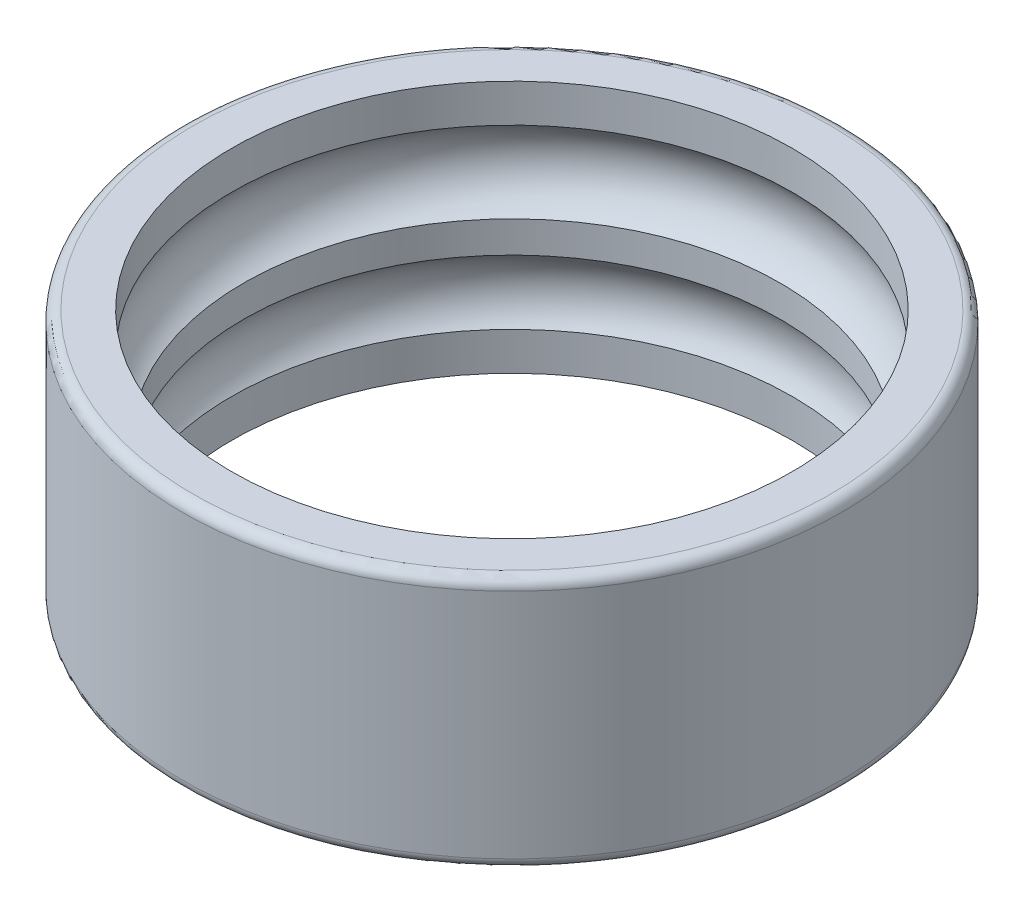
ISO-10303-21;
HEADER;
FILE_DESCRIPTION(('STEP AP214'),'2;1');
FILE_NAME('part.step','',(''),(''),'','','');
FILE_SCHEMA(('AUTOMOTIVE_DESIGN { 1 0 10303 214 1 1 1 1 }'));
ENDSEC;
DATA;
#1=APPLICATION_CONTEXT('core data for automotive mechanical design processes');
#2=APPLICATION_PROTOCOL_DEFINITION('international standard','automotive_design',2000,#1);
#3=PRODUCT_CONTEXT('',#1,'mechanical');
#4=PRODUCT('Part','Part','',(#3));
#5=PRODUCT_RELATED_PRODUCT_CATEGORY('part','',(#4));
#6=PRODUCT_DEFINITION_FORMATION('','',#4);
#7=PRODUCT_DEFINITION_CONTEXT('part definition',#1,'design');
#8=PRODUCT_DEFINITION('design','',#6,#7);
#9=PRODUCT_DEFINITION_SHAPE('','',#8);
#10=(LENGTH_UNIT() NAMED_UNIT(*) SI_UNIT(.MILLI.,.METRE.));
#11=(NAMED_UNIT(*) PLANE_ANGLE_UNIT() SI_UNIT($,.RADIAN.));
#12=(NAMED_UNIT(*) SI_UNIT($,.STERADIAN.) SOLID_ANGLE_UNIT());
#13=UNCERTAINTY_MEASURE_WITH_UNIT(LENGTH_MEASURE(1.E-05),#10,'distance_accuracy_value','');
#14=(GEOMETRIC_REPRESENTATION_CONTEXT(3) GLOBAL_UNCERTAINTY_ASSIGNED_CONTEXT((#13)) GLOBAL_UNIT_ASSIGNED_CONTEXT((#10,
#11,#12)) REPRESENTATION_CONTEXT('',''));
#15=CARTESIAN_POINT('',(0.,0.,0.));
#16=DIRECTION('',(0.,0.,1.));
#17=DIRECTION('',(1.,0.,0.));
#18=AXIS2_PLACEMENT_3D('',#15,#16,#17);
#19=CARTESIAN_POINT('',(0.,-1.,0.));
#20=DIRECTION('',(0.,1.,0.));
#21=DIRECTION('',(0.,0.,1.));
#22=AXIS2_PLACEMENT_3D('',#19,#20,#21);
#23=TOROIDAL_SURFACE('',#22,30.,1.);
#24=CARTESIAN_POINT('',(0.,-1.,0.));
#25=DIRECTION('',(0.,1.,0.));
#26=DIRECTION('',(0.,0.,1.));
#27=AXIS2_PLACEMENT_3D('',#24,#25,#26);
#28=CIRCLE('',#27,31.);
#29=CARTESIAN_POINT('',(0.,-1.,-31.));
#30=VERTEX_POINT('',#29);
#31=EDGE_CURVE('E11',#30,#30,#28,.T.);
#32=ORIENTED_EDGE('',*,*,#31,.T.);
#33=EDGE_LOOP('',(#32));
#34=FACE_BOUND('',#33,.T.);
#35=CARTESIAN_POINT('',(0.,0.,0.));
#36=DIRECTION('',(0.,1.,0.));
#37=DIRECTION('',(0.,0.,1.));
#38=AXIS2_PLACEMENT_3D('',#35,#36,#37);
#39=CIRCLE('',#38,30.);
#40=CARTESIAN_POINT('',(0.,0.,-30.));
#41=VERTEX_POINT('',#40);
#42=EDGE_CURVE('E20',#41,#41,#39,.T.);
#43=ORIENTED_EDGE('',*,*,#42,.F.);
#44=EDGE_LOOP('',(#43));
#45=FACE_BOUND('',#44,.T.);
#46=ADVANCED_FACE('F16',(#34,#45),#23,.T.);
#47=CARTESIAN_POINT('',(0.,0.,28.18));
#48=DIRECTION('',(0.,1.,0.));
#49=DIRECTION('',(1.,0.,0.));
#50=AXIS2_PLACEMENT_3D('',#47,#48,#49);
#51=PLANE('',#50);
#52=CARTESIAN_POINT('',(0.,0.,0.));
#53=DIRECTION('',(0.,1.,0.));
#54=DIRECTION('',(0.,0.,1.));
#55=AXIS2_PLACEMENT_3D('',#52,#53,#54);
#56=CIRCLE('',#55,26.36);
#57=CARTESIAN_POINT('',(0.,0.,-26.36));
#58=VERTEX_POINT('',#57);
#59=EDGE_CURVE('E109',#58,#58,#56,.T.);
#60=ORIENTED_EDGE('',*,*,#59,.F.);
#61=EDGE_LOOP('',(#60));
#62=FACE_BOUND('',#61,.T.);
#63=ORIENTED_EDGE('',*,*,#42,.T.);
#64=EDGE_LOOP('',(#63));
#65=FACE_BOUND('',#64,.T.);
#66=ADVANCED_FACE('F137',(#62,#65),#51,.T.);
#67=CARTESIAN_POINT('',(0.,-1.79087926580383,0.));
#68=DIRECTION('',(0.,1.,0.));
#69=DIRECTION('',(0.,0.,1.));
#70=AXIS2_PLACEMENT_3D('',#67,#68,#69);
#71=CYLINDRICAL_SURFACE('',#70,26.36);
#72=ORIENTED_EDGE('',*,*,#59,.T.);
#73=EDGE_LOOP('',(#72));
#74=FACE_BOUND('',#73,.T.);
#75=CARTESIAN_POINT('',(0.,-3.58175853160766,0.));
#76=DIRECTION('',(0.,1.,0.));
#77=DIRECTION('',(0.,0.,1.));
#78=AXIS2_PLACEMENT_3D('',#75,#76,#77);
#79=CIRCLE('',#78,26.36);
#80=CARTESIAN_POINT('',(11.4371753631388,-3.58175853160766,23.7495393579078));
#81=VERTEX_POINT('',#80);
#82=EDGE_CURVE('E110',#81,#81,#79,.T.);
#83=ORIENTED_EDGE('',*,*,#82,.F.);
#84=EDGE_LOOP('',(#83));
#85=FACE_BOUND('',#84,.T.);
#86=ADVANCED_FACE('F143',(#74,#85),#71,.F.);
#87=CARTESIAN_POINT('',(0.,-11.9,0.));
#88=DIRECTION('',(0.,1.,0.));
#89=DIRECTION('',(0.,0.,1.));
#90=AXIS2_PLACEMENT_3D('',#87,#88,#89);
#91=CYLINDRICAL_SURFACE('',#90,31.);
#92=CARTESIAN_POINT('',(0.,-22.8,0.));
#93=DIRECTION('',(0.,1.,0.));
#94=DIRECTION('',(0.,0.,1.));
#95=AXIS2_PLACEMENT_3D('',#92,#93,#94);
#96=CIRCLE('',#95,31.);
#97=CARTESIAN_POINT('',(0.,-22.8,-31.));
#98=VERTEX_POINT('',#97);
#99=EDGE_CURVE('E76',#98,#98,#96,.T.);
#100=ORIENTED_EDGE('',*,*,#99,.T.);
#101=EDGE_LOOP('',(#100));
#102=FACE_BOUND('',#101,.T.);
#103=ORIENTED_EDGE('',*,*,#31,.F.);
#104=EDGE_LOOP('',(#103));
#105=FACE_BOUND('',#104,.T.);
#106=ADVANCED_FACE('F149',(#102,#105),#91,.T.);
#107=CARTESIAN_POINT('',(0.,-6.545,0.));
#108=DIRECTION('',(0.,1.,0.));
#109=DIRECTION('',(0.,0.,1.));
#110=AXIS2_PLACEMENT_3D('',#107,#108,#109);
#111=TOROIDAL_SURFACE('',#110,23.,4.48);
#112=ORIENTED_EDGE('',*,*,#82,.T.);
#113=EDGE_LOOP('',(#112));
#114=FACE_BOUND('',#113,.T.);
#115=CARTESIAN_POINT('',(0.,-10.4247938089543,0.));
#116=DIRECTION('',(0.,1.,0.));
#117=DIRECTION('',(0.,0.,1.));
#118=AXIS2_PLACEMENT_3D('',#115,#116,#117);
#119=CIRCLE('',#118,25.24);
#120=CARTESIAN_POINT('',(10.9512255753272,-10.4247938089543,22.740454225857));
#121=VERTEX_POINT('',#120);
#122=EDGE_CURVE('E66',#121,#121,#119,.T.);
#123=ORIENTED_EDGE('',*,*,#122,.F.);
#124=EDGE_LOOP('',(#123));
#125=FACE_BOUND('',#124,.T.);
#126=ADVANCED_FACE('F151',(#114,#125),#111,.F.);
#127=CARTESIAN_POINT('',(0.,-22.8,0.));
#128=DIRECTION('',(0.,1.,0.));
#129=DIRECTION('',(0.,0.,1.));
#130=AXIS2_PLACEMENT_3D('',#127,#128,#129);
#131=TOROIDAL_SURFACE('',#130,30.,1.);
#132=CARTESIAN_POINT('',(0.,-23.8,0.));
#133=DIRECTION('',(0.,1.,0.));
#134=DIRECTION('',(0.,0.,1.));
#135=AXIS2_PLACEMENT_3D('',#132,#133,#134);
#136=CIRCLE('',#135,30.);
#137=CARTESIAN_POINT('',(0.,-23.8,-30.));
#138=VERTEX_POINT('',#137);
#139=EDGE_CURVE('E106',#138,#138,#136,.T.);
#140=ORIENTED_EDGE('',*,*,#139,.T.);
#141=EDGE_LOOP('',(#140));
#142=FACE_BOUND('',#141,.T.);
#143=ORIENTED_EDGE('',*,*,#99,.F.);
#144=EDGE_LOOP('',(#143));
#145=FACE_BOUND('',#144,.T.);
#146=ADVANCED_FACE('F122',(#142,#145),#131,.T.);
#147=CARTESIAN_POINT('',(0.,-17.255,0.));
#148=DIRECTION('',(0.,1.,0.));
#149=DIRECTION('',(0.,0.,1.));
#150=AXIS2_PLACEMENT_3D('',#147,#148,#149);
#151=TOROIDAL_SURFACE('',#150,23.,4.48);
#152=CARTESIAN_POINT('',(0.,-13.3752061910457,0.));
#153=DIRECTION('',(0.,1.,0.));
#154=DIRECTION('',(0.,0.,1.));
#155=AXIS2_PLACEMENT_3D('',#152,#153,#154);
#156=CIRCLE('',#155,25.24);
#157=CARTESIAN_POINT('',(5.61642837305738,-13.3752061910457,24.6071805034692));
#158=VERTEX_POINT('',#157);
#159=EDGE_CURVE('E99',#158,#158,#156,.T.);
#160=ORIENTED_EDGE('',*,*,#159,.T.);
#161=EDGE_LOOP('',(#160));
#162=FACE_BOUND('',#161,.T.);
#163=CARTESIAN_POINT('',(0.,-20.2182414683923,0.));
#164=DIRECTION('',(0.,1.,0.));
#165=DIRECTION('',(0.,0.,1.));
#166=AXIS2_PLACEMENT_3D('',#163,#164,#165);
#167=CIRCLE('',#166,26.36);
#168=CARTESIAN_POINT('',(5.86565181908845,-20.2182414683923,25.6990997651129));
#169=VERTEX_POINT('',#168);
#170=EDGE_CURVE('E88',#169,#169,#167,.T.);
#171=ORIENTED_EDGE('',*,*,#170,.F.);
#172=EDGE_LOOP('',(#171));
#173=FACE_BOUND('',#172,.T.);
#174=ADVANCED_FACE('F89',(#162,#173),#151,.F.);
#175=CARTESIAN_POINT('',(0.,-23.8,28.18));
#176=DIRECTION('',(0.,-1.,0.));
#177=DIRECTION('',(-1.,0.,0.));
#178=AXIS2_PLACEMENT_3D('',#175,#176,#177);
#179=PLANE('',#178);
#180=ORIENTED_EDGE('',*,*,#139,.F.);
#181=EDGE_LOOP('',(#180));
#182=FACE_BOUND('',#181,.T.);
#183=CARTESIAN_POINT('',(0.,-23.8,0.));
#184=DIRECTION('',(0.,1.,0.));
#185=DIRECTION('',(0.,0.,1.));
#186=AXIS2_PLACEMENT_3D('',#183,#184,#185);
#187=CIRCLE('',#186,26.36);
#188=CARTESIAN_POINT('',(0.,-23.8,-26.36));
#189=VERTEX_POINT('',#188);
#190=EDGE_CURVE('E92',#189,#189,#187,.T.);
#191=ORIENTED_EDGE('',*,*,#190,.T.);
#192=EDGE_LOOP('',(#191));
#193=FACE_BOUND('',#192,.T.);
#194=ADVANCED_FACE('F124',(#182,#193),#179,.T.);
#195=CARTESIAN_POINT('',(0.,-22.0091207341962,0.));
#196=DIRECTION('',(0.,1.,0.));
#197=DIRECTION('',(0.,0.,1.));
#198=AXIS2_PLACEMENT_3D('',#195,#196,#197);
#199=CYLINDRICAL_SURFACE('',#198,26.36);
#200=ORIENTED_EDGE('',*,*,#170,.T.);
#201=EDGE_LOOP('',(#200));
#202=FACE_BOUND('',#201,.T.);
#203=ORIENTED_EDGE('',*,*,#190,.F.);
#204=EDGE_LOOP('',(#203));
#205=FACE_BOUND('',#204,.T.);
#206=ADVANCED_FACE('F18',(#202,#205),#199,.F.);
#207=CARTESIAN_POINT('',(0.,-11.9,0.));
#208=DIRECTION('',(0.,1.,0.));
#209=DIRECTION('',(0.,0.,1.));
#210=AXIS2_PLACEMENT_3D('',#207,#208,#209);
#211=CYLINDRICAL_SURFACE('',#210,25.24);
#212=ORIENTED_EDGE('',*,*,#122,.T.);
#213=EDGE_LOOP('',(#212));
#214=FACE_BOUND('',#213,.T.);
#215=ORIENTED_EDGE('',*,*,#159,.F.);
#216=EDGE_LOOP('',(#215));
#217=FACE_BOUND('',#216,.T.);
#218=ADVANCED_FACE('F130',(#214,#217),#211,.F.);
#219=CLOSED_SHELL('',(#46,#66,#86,#106,#126,#146,#174,#194,#206,#218));
#220=MANIFOLD_SOLID_BREP('B1',#219);
#221=ADVANCED_BREP_SHAPE_REPRESENTATION('',(#18,#220),#14);
#222=SHAPE_DEFINITION_REPRESENTATION(#9,#221);
ENDSEC;
END-ISO-10303-21;
